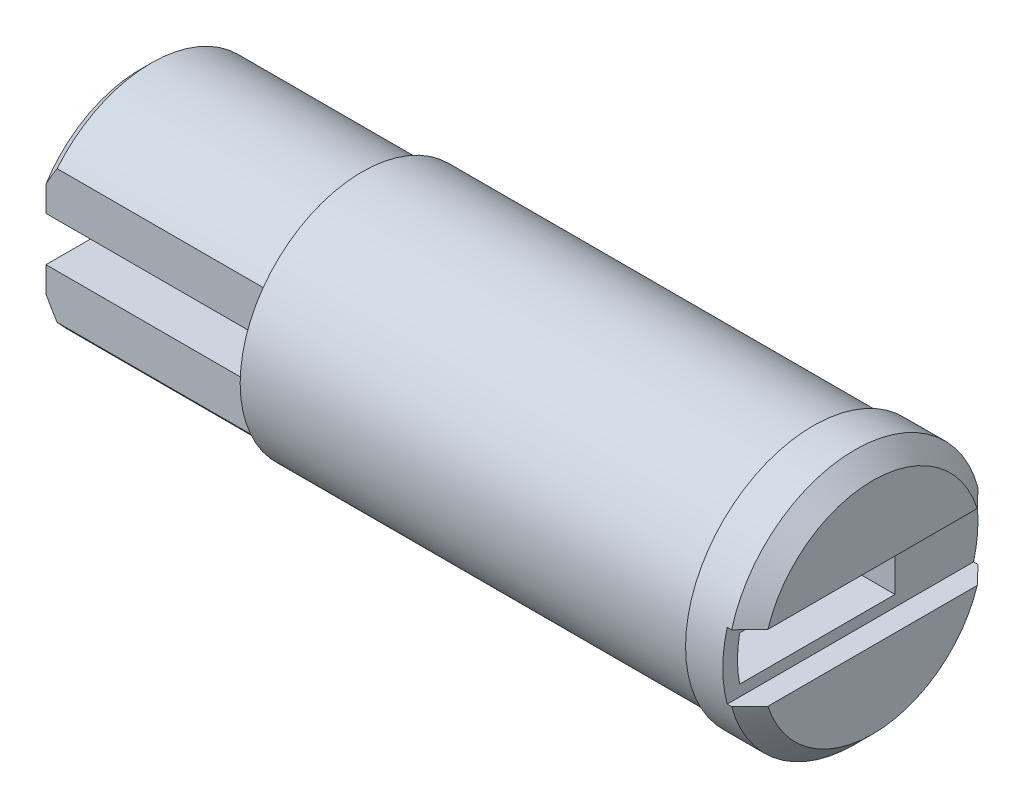
ISO-10303-21;
HEADER;
FILE_DESCRIPTION(('STEP AP214'),'2;1');
FILE_NAME('part.step','',(''),(''),'','','');
FILE_SCHEMA(('AUTOMOTIVE_DESIGN { 1 0 10303 214 1 1 1 1 }'));
ENDSEC;
DATA;
#1=APPLICATION_CONTEXT('core data for automotive mechanical design processes');
#2=APPLICATION_PROTOCOL_DEFINITION('international standard','automotive_design',2000,#1);
#3=PRODUCT_CONTEXT('',#1,'mechanical');
#4=PRODUCT('Part','Part','',(#3));
#5=PRODUCT_RELATED_PRODUCT_CATEGORY('part','',(#4));
#6=PRODUCT_DEFINITION_FORMATION('','',#4);
#7=PRODUCT_DEFINITION_CONTEXT('part definition',#1,'design');
#8=PRODUCT_DEFINITION('design','',#6,#7);
#9=PRODUCT_DEFINITION_SHAPE('','',#8);
#10=(LENGTH_UNIT() NAMED_UNIT(*) SI_UNIT(.MILLI.,.METRE.));
#11=(NAMED_UNIT(*) PLANE_ANGLE_UNIT() SI_UNIT($,.RADIAN.));
#12=(NAMED_UNIT(*) SI_UNIT($,.STERADIAN.) SOLID_ANGLE_UNIT());
#13=UNCERTAINTY_MEASURE_WITH_UNIT(LENGTH_MEASURE(1.E-05),#10,'distance_accuracy_value','');
#14=(GEOMETRIC_REPRESENTATION_CONTEXT(3) GLOBAL_UNCERTAINTY_ASSIGNED_CONTEXT((#13)) GLOBAL_UNIT_ASSIGNED_CONTEXT((#10,
#11,#12)) REPRESENTATION_CONTEXT('',''));
#15=CARTESIAN_POINT('',(0.,0.,0.));
#16=DIRECTION('',(0.,0.,1.));
#17=DIRECTION('',(1.,0.,0.));
#18=AXIS2_PLACEMENT_3D('',#15,#16,#17);
#19=CARTESIAN_POINT('',(-2.,3.,4.25));
#20=DIRECTION('',(0.,0.,-1.));
#21=DIRECTION('',(-1.,0.,0.));
#22=AXIS2_PLACEMENT_3D('',#19,#20,#21);
#23=PLANE('',#22);
#24=DIRECTION('',(0.,1.,0.));
#25=VECTOR('',#24,1.);
#26=CARTESIAN_POINT('',(8.,3.,4.25));
#27=LINE('',#26,#25);
#28=CARTESIAN_POINT('',(8.,-3.,4.25));
#29=VERTEX_POINT('',#28);
#30=CARTESIAN_POINT('',(8.,-1.,4.25));
#31=VERTEX_POINT('',#30);
#32=EDGE_CURVE('E204',#29,#31,#27,.T.);
#33=ORIENTED_EDGE('',*,*,#32,.T.);
#34=DIRECTION('',(-1.,0.,0.));
#35=VECTOR('',#34,1.);
#36=CARTESIAN_POINT('',(-2.,-1.,4.25));
#37=LINE('',#36,#35);
#38=CARTESIAN_POINT('',(-2.,-1.,4.25));
#39=VERTEX_POINT('',#38);
#40=EDGE_CURVE('E193',#31,#39,#37,.T.);
#41=ORIENTED_EDGE('',*,*,#40,.T.);
#42=DIRECTION('',(0.,1.,0.));
#43=VECTOR('',#42,1.);
#44=CARTESIAN_POINT('',(-2.,3.,4.25));
#45=LINE('',#44,#43);
#46=CARTESIAN_POINT('',(-2.,-2.14783030103756,4.25));
#47=VERTEX_POINT('',#46);
#48=EDGE_CURVE('E205',#47,#39,#45,.T.);
#49=ORIENTED_EDGE('',*,*,#48,.F.);
#50=CARTESIAN_POINT('',(-2.,-2.14783030103756,4.25));
#51=CARTESIAN_POINT('',(-1.96136096445825,-2.22058458919887,4.25));
#52=CARTESIAN_POINT('',(-1.92184405055517,-2.29286754843841,4.25));
#53=CARTESIAN_POINT('',(-1.84125213542231,-2.4365232828716,4.25));
#54=CARTESIAN_POINT('',(-1.80017774846276,-2.50789640236822,4.25));
#55=CARTESIAN_POINT('',(-1.71664051598513,-2.64981754337214,4.25));
#56=CARTESIAN_POINT('',(-1.6741777507649,-2.72036561227755,4.25));
#57=CARTESIAN_POINT('',(-1.58799284687577,-2.86072672688115,4.25));
#58=CARTESIAN_POINT('',(-1.54427022308355,-2.93053947491529,4.25));
#59=CARTESIAN_POINT('',(-1.5,-3.,4.25));
#60=B_SPLINE_CURVE_WITH_KNOTS('',3,(#50,#51,#52,#53,#54,#55,#56,#57,#58,#59),.UNSPECIFIED.,.F.,
.F.,(4,2,2,2,4),(0.,0.247121990754865,0.494147509738748,0.741158767008643,0.988266444534275),.UNSPECIFIED.);
#61=CARTESIAN_POINT('',(-1.5,-3.,4.25));
#62=VERTEX_POINT('',#61);
#63=EDGE_CURVE('E409',#47,#62,#60,.T.);
#64=ORIENTED_EDGE('',*,*,#63,.T.);
#65=DIRECTION('',(1.,0.,0.));
#66=VECTOR('',#65,1.);
#67=CARTESIAN_POINT('',(-2.,-3.,4.25));
#68=LINE('',#67,#66);
#69=EDGE_CURVE('E222',#62,#29,#68,.T.);
#70=ORIENTED_EDGE('',*,*,#69,.T.);
#71=EDGE_LOOP('',(#33,#41,#49,#64,#70));
#72=FACE_BOUND('',#71,.T.);
#73=ADVANCED_FACE('F33',(#72),#23,.F.);
#74=CARTESIAN_POINT('',(8.,0.,0.));
#75=DIRECTION('',(-1.,0.,0.));
#76=DIRECTION('',(0.,0.,1.));
#77=AXIS2_PLACEMENT_3D('',#74,#75,#76);
#78=PLANE('',#77);
#79=DIRECTION('',(0.,0.,1.));
#80=VECTOR('',#79,1.);
#81=CARTESIAN_POINT('',(8.,-1.,0.));
#82=LINE('',#81,#80);
#83=CARTESIAN_POINT('',(8.,-0.999999999999999,4.99015542280877));
#84=VERTEX_POINT('',#83);
#85=EDGE_CURVE('E196',#31,#84,#82,.T.);
#86=ORIENTED_EDGE('',*,*,#85,.F.);
#87=ORIENTED_EDGE('',*,*,#32,.F.);
#88=CARTESIAN_POINT('',(8.,0.515625000000004,0.));
#89=DIRECTION('',(-1.,0.,0.));
#90=DIRECTION('',(0.,0.,1.));
#91=AXIS2_PLACEMENT_3D('',#88,#89,#90);
#92=CIRCLE('',#91,5.515625);
#93=CARTESIAN_POINT('',(8.,-3.,-4.25));
#94=VERTEX_POINT('',#93);
#95=EDGE_CURVE('E214',#94,#29,#92,.T.);
#96=ORIENTED_EDGE('',*,*,#95,.F.);
#97=DIRECTION('',(0.,-1.,0.));
#98=VECTOR('',#97,1.);
#99=CARTESIAN_POINT('',(8.,3.,-4.25));
#100=LINE('',#99,#98);
#101=CARTESIAN_POINT('',(8.,3.,-4.25));
#102=VERTEX_POINT('',#101);
#103=EDGE_CURVE('E211',#102,#94,#100,.T.);
#104=ORIENTED_EDGE('',*,*,#103,.F.);
#105=CARTESIAN_POINT('',(8.,-0.515625000000004,0.));
#106=DIRECTION('',(-1.,0.,0.));
#107=DIRECTION('',(0.,0.,-1.));
#108=AXIS2_PLACEMENT_3D('',#105,#106,#107);
#109=CIRCLE('',#108,5.515625);
#110=CARTESIAN_POINT('',(8.,3.,4.25));
#111=VERTEX_POINT('',#110);
#112=EDGE_CURVE('E199',#111,#102,#109,.T.);
#113=ORIENTED_EDGE('',*,*,#112,.F.);
#114=CARTESIAN_POINT('',(8.,0.999999999999999,4.25));
#115=VERTEX_POINT('',#114);
#116=EDGE_CURVE('E217',#115,#111,#27,.T.);
#117=ORIENTED_EDGE('',*,*,#116,.F.);
#118=DIRECTION('',(0.,0.,-1.));
#119=VECTOR('',#118,1.);
#120=CARTESIAN_POINT('',(8.,1.,0.));
#121=LINE('',#120,#119);
#122=CARTESIAN_POINT('',(8.,0.999999999999999,4.99015542280877));
#123=VERTEX_POINT('',#122);
#124=EDGE_CURVE('E191',#123,#115,#121,.T.);
#125=ORIENTED_EDGE('',*,*,#124,.F.);
#126=CARTESIAN_POINT('',(8.,0.,0.));
#127=DIRECTION('',(-1.,0.,0.));
#128=DIRECTION('',(0.,0.,1.));
#129=AXIS2_PLACEMENT_3D('',#126,#127,#128);
#130=CIRCLE('',#129,5.08936647764609);
#131=EDGE_CURVE('E168',#84,#123,#130,.T.);
#132=ORIENTED_EDGE('',*,*,#131,.F.);
#133=EDGE_LOOP('',(#86,#87,#96,#104,#113,#117,#125,#132));
#134=FACE_BOUND('',#133,.T.);
#135=CARTESIAN_POINT('',(8.,0.,0.));
#136=DIRECTION('',(-1.,0.,0.));
#137=DIRECTION('',(0.,0.,1.));
#138=AXIS2_PLACEMENT_3D('',#135,#136,#137);
#139=CIRCLE('',#138,5.5);
#140=CARTESIAN_POINT('',(8.,0.,5.5));
#141=VERTEX_POINT('',#140);
#142=EDGE_CURVE('E228',#141,#141,#139,.T.);
#143=ORIENTED_EDGE('',*,*,#142,.T.);
#144=EDGE_LOOP('',(#143));
#145=FACE_BOUND('',#144,.T.);
#146=ADVANCED_FACE('F295',(#134,#145),#78,.T.);
#147=CARTESIAN_POINT('',(0.,0.,0.));
#148=DIRECTION('',(-1.,0.,0.));
#149=DIRECTION('',(0.,0.,1.));
#150=AXIS2_PLACEMENT_3D('',#147,#148,#149);
#151=CYLINDRICAL_SURFACE('',#150,5.5);
#152=CARTESIAN_POINT('',(28.3218681851233,0.,0.));
#153=DIRECTION('',(-1.,0.,0.));
#154=DIRECTION('',(0.,0.,1.));
#155=AXIS2_PLACEMENT_3D('',#152,#153,#154);
#156=CIRCLE('',#155,5.5);
#157=CARTESIAN_POINT('',(28.3218681851233,0.,5.5));
#158=VERTEX_POINT('',#157);
#159=EDGE_CURVE('E251',#158,#158,#156,.T.);
#160=ORIENTED_EDGE('',*,*,#159,.T.);
#161=EDGE_LOOP('',(#160));
#162=FACE_BOUND('',#161,.T.);
#163=ORIENTED_EDGE('',*,*,#142,.F.);
#164=EDGE_LOOP('',(#163));
#165=FACE_BOUND('',#164,.T.);
#166=ADVANCED_FACE('F291',(#162,#165),#151,.T.);
#167=CARTESIAN_POINT('',(31.,0.,0.));
#168=DIRECTION('',(-1.,0.,0.));
#169=DIRECTION('',(0.,0.,1.));
#170=AXIS2_PLACEMENT_3D('',#167,#168,#169);
#171=PLANE('',#170);
#172=CARTESIAN_POINT('',(31.,0.,0.));
#173=DIRECTION('',(-1.,0.,0.));
#174=DIRECTION('',(0.,0.,1.));
#175=AXIS2_PLACEMENT_3D('',#172,#173,#174);
#176=CIRCLE('',#175,4.95);
#177=CARTESIAN_POINT('',(31.,-1.5,4.71725555805492));
#178=VERTEX_POINT('',#177);
#179=CARTESIAN_POINT('',(31.,-1.5,-4.71725555805492));
#180=VERTEX_POINT('',#179);
#181=EDGE_CURVE('E262',#178,#180,#176,.F.);
#182=ORIENTED_EDGE('',*,*,#181,.T.);
#183=DIRECTION('',(0.,0.,-1.));
#184=VECTOR('',#183,1.);
#185=CARTESIAN_POINT('',(31.,-1.5,-6.47568722775106));
#186=LINE('',#185,#184);
#187=EDGE_CURVE('E233',#178,#180,#186,.T.);
#188=ORIENTED_EDGE('',*,*,#187,.F.);
#189=EDGE_LOOP('',(#182,#188));
#190=FACE_BOUND('',#189,.T.);
#191=ADVANCED_FACE('F294',(#190),#171,.F.);
#192=CARTESIAN_POINT('',(30.2,0.,0.));
#193=DIRECTION('',(-1.,0.,0.));
#194=DIRECTION('',(0.,0.,1.));
#195=AXIS2_PLACEMENT_3D('',#192,#193,#194);
#196=CONICAL_SURFACE('',#195,5.75,0.785398163397447);
#197=CARTESIAN_POINT('',(23.2831244979976,-1.5,12.5777476116842));
#198=CARTESIAN_POINT('',(23.6106125192825,-1.5,12.2479317848869));
#199=CARTESIAN_POINT('',(23.938016440083,-1.5,11.9180323555354));
#200=CARTESIAN_POINT('',(24.5926599526162,-1.5,11.2579311822591));
#201=CARTESIAN_POINT('',(24.919899494525,-1.5,10.9277293889257));
#202=CARTESIAN_POINT('',(25.575474802564,-1.5,10.2656186582));
#203=CARTESIAN_POINT('',(25.9038092856133,-1.5,9.93370845015689));
#204=CARTESIAN_POINT('',(26.5600030119619,-1.5,9.26955670004262));
#205=CARTESIAN_POINT('',(26.8878623408399,-1.5,8.93731524254916));
#206=CARTESIAN_POINT('',(27.4866309286773,-1.5,8.32951666405265));
#207=CARTESIAN_POINT('',(27.7576286275234,-1.5,8.05404669087916));
#208=CARTESIAN_POINT('',(28.2991106065372,-1.5,7.50258892540886));
#209=CARTESIAN_POINT('',(28.5695948737149,-1.5,7.22660112035295));
#210=CARTESIAN_POINT('',(29.1100553942131,-1.5,6.6736991111905));
#211=CARTESIAN_POINT('',(29.3800310733099,-1.5,6.39678434534002));
#212=CARTESIAN_POINT('',(29.9189042539413,-1.5,5.84195868206374));
#213=CARTESIAN_POINT('',(30.187801856092,-1.5,5.56404788240879));
#214=CARTESIAN_POINT('',(30.7228839913038,-1.5,5.00785000532498));
#215=CARTESIAN_POINT('',(30.9890751624553,-1.5,4.72956933197649));
#216=CARTESIAN_POINT('',(31.3864395323754,-1.5,4.31022532675707));
#217=CARTESIAN_POINT('',(31.5185986617121,-1.5,4.17009688991528));
#218=CARTESIAN_POINT('',(31.7820272926027,-1.5,3.88901186832305));
#219=CARTESIAN_POINT('',(31.913296816015,-1.5,3.7480553040804));
#220=CARTESIAN_POINT('',(32.1744286099579,-1.5,3.46524033695717));
#221=CARTESIAN_POINT('',(32.304292722371,-1.5,3.32338363865537));
#222=CARTESIAN_POINT('',(32.5623041698702,-1.5,3.03812241561348));
#223=CARTESIAN_POINT('',(32.6904515534735,-1.5,2.89471793482372));
#224=CARTESIAN_POINT('',(32.9441476184633,-1.5,2.60575908799829));
#225=CARTESIAN_POINT('',(33.0696977729846,-1.5,2.46020602564568));
#226=CARTESIAN_POINT('',(33.254985928031,-1.5,2.2393481135037));
#227=CARTESIAN_POINT('',(33.3162372381257,-1.5,2.16531401426996));
#228=CARTESIAN_POINT('',(33.4374196033146,-1.5,2.01617470445725));
#229=CARTESIAN_POINT('',(33.4973507348241,-1.5,1.94106955629006));
#230=CARTESIAN_POINT('',(33.5782698436103,-1.5,1.83722903202372));
#231=CARTESIAN_POINT('',(33.600012247261,-1.5,1.80908081953309));
#232=CARTESIAN_POINT('',(33.6432281273821,-1.5,1.75257753142135));
#233=CARTESIAN_POINT('',(33.6647015966592,-1.5,1.72422245029902));
#234=CARTESIAN_POINT('',(33.7286739687197,-1.5,1.6388152497477));
#235=CARTESIAN_POINT('',(33.7707225538424,-1.5,1.58142408913306));
#236=CARTESIAN_POINT('',(33.8534038385082,-1.5,1.46539312270642));
#237=CARTESIAN_POINT('',(33.8940324357551,-1.5,1.40675037945692));
#238=CARTESIAN_POINT('',(33.9732995803079,-1.5,1.288135716928));
#239=CARTESIAN_POINT('',(34.0119382273678,-1.5,1.22816386449122));
#240=CARTESIAN_POINT('',(34.0852433937047,-1.5,1.10880657043406));
#241=CARTESIAN_POINT('',(34.1200034130085,-1.5,1.04947960158135));
#242=CARTESIAN_POINT('',(34.1863019805062,-1.5,0.929065553211411));
#243=CARTESIAN_POINT('',(34.2178394013315,-1.5,0.867977867255189));
#244=CARTESIAN_POINT('',(34.3057927505497,-1.5,0.682114449087072));
#245=CARTESIAN_POINT('',(34.3560086218704,-1.5,0.554037627098471));
#246=CARTESIAN_POINT('',(34.4034701847537,-1.5,0.378795610938711));
#247=CARTESIAN_POINT('',(34.4136358828838,-1.5,0.335090660882677));
#248=CARTESIAN_POINT('',(34.4304174031391,-1.5,0.246983491824971));
#249=CARTESIAN_POINT('',(34.4370327403313,-1.5,0.202581178424623));
#250=CARTESIAN_POINT('',(34.4463609186601,-1.5,0.113510335232054));
#251=CARTESIAN_POINT('',(34.4490864380443,-1.5,0.0688431490010885));
#252=CARTESIAN_POINT('',(34.4505252212899,-1.5,-0.020571057366597));
#253=CARTESIAN_POINT('',(34.4492372483295,-1.5,-0.0653180978651294));
#254=CARTESIAN_POINT('',(34.4427271558943,-1.5,-0.154404803754268));
#255=CARTESIAN_POINT('',(34.437515142812,-1.5,-0.198745219969365));
#256=CARTESIAN_POINT('',(34.4234393611576,-1.5,-0.286844656095083));
#257=CARTESIAN_POINT('',(34.414574723681,-1.5,-0.330603535108224));
#258=CARTESIAN_POINT('',(34.3935540216483,-1.5,-0.417506018885773));
#259=CARTESIAN_POINT('',(34.381384465674,-1.5,-0.460646321286136));
#260=CARTESIAN_POINT('',(34.3542244948807,-1.5,-0.546016805708314));
#261=CARTESIAN_POINT('',(34.3392341358132,-1.5,-0.588247005699423));
#262=CARTESIAN_POINT('',(34.2797611208826,-1.5,-0.741873156115527));
#263=CARTESIAN_POINT('',(34.2279922142325,-1.5,-0.850444267426383));
#264=CARTESIAN_POINT('',(34.1142149851413,-1.5,-1.06211675493479));
#265=CARTESIAN_POINT('',(34.052181438521,-1.5,-1.16520380882772));
#266=CARTESIAN_POINT('',(33.9213351830724,-1.5,-1.36802963557161));
#267=CARTESIAN_POINT('',(33.8524754570487,-1.5,-1.46773777929211));
#268=CARTESIAN_POINT('',(33.7461410999326,-1.5,-1.61497008208429));
#269=CARTESIAN_POINT('',(33.7102104859219,-1.5,-1.66363175908382));
#270=CARTESIAN_POINT('',(33.637494720863,-1.5,-1.76031156483775));
#271=CARTESIAN_POINT('',(33.600709599108,-1.5,-1.80832971556395));
#272=CARTESIAN_POINT('',(33.4796280208949,-1.5,-1.96401731251528));
#273=CARTESIAN_POINT('',(33.3938988034742,-1.5,-2.07057105801895));
#274=CARTESIAN_POINT('',(33.2200465185019,-1.5,-2.28171271706748));
#275=CARTESIAN_POINT('',(33.1319231607852,-1.5,-2.3863003897058));
#276=CARTESIAN_POINT('',(32.9539550515347,-1.5,-2.59406226396158));
#277=CARTESIAN_POINT('',(32.8641096961761,-1.5,-2.69723594717521));
#278=CARTESIAN_POINT('',(32.683178565385,-1.5,-2.90249140614543));
#279=CARTESIAN_POINT('',(32.5920927586895,-1.5,-3.00457315426586));
#280=CARTESIAN_POINT('',(32.3171929099314,-1.5,-3.30986483996333));
#281=CARTESIAN_POINT('',(32.1319930942354,-1.5,-3.51182558550891));
#282=CARTESIAN_POINT('',(31.7594175960904,-1.5,-3.91363754986367));
#283=CARTESIAN_POINT('',(31.5720423918757,-1.5,-4.11348921455511));
#284=CARTESIAN_POINT('',(31.1967466463848,-1.5,-4.51083764212696));
#285=CARTESIAN_POINT('',(31.0088332265588,-1.5,-4.70834113723603));
#286=CARTESIAN_POINT('',(30.6319939307126,-1.5,-5.10239927391052));
#287=CARTESIAN_POINT('',(30.4430679993581,-1.5,-5.29895386247848));
#288=CARTESIAN_POINT('',(29.8755083067196,-1.5,-5.88729473304938));
#289=CARTESIAN_POINT('',(29.4958109749607,-1.5,-6.27805436866732));
#290=CARTESIAN_POINT('',(28.6329776607364,-1.5,-7.16243442168079));
#291=CARTESIAN_POINT('',(28.149362603451,-1.5,-7.65558638620526));
#292=CARTESIAN_POINT('',(27.1805869842656,-1.5,-8.640626996177));
#293=CARTESIAN_POINT('',(26.6954260452392,-1.5,-9.13251527040277));
#294=CARTESIAN_POINT('',(25.7226688780455,-1.5,-10.1170204563805));
#295=CARTESIAN_POINT('',(25.2350698442585,-1.5,-10.6096345942695));
#296=CARTESIAN_POINT('',(24.2594088653942,-1.5,-11.5941350078477));
#297=CARTESIAN_POINT('',(23.7713470851387,-1.5,-12.0860214468485));
#298=CARTESIAN_POINT('',(23.2831244979976,-1.5,-12.5777476116842));
#299=B_SPLINE_CURVE_WITH_KNOTS('',3,(#197,#198,#199,#200,#201,#202,#203,#204,#205,#206,#207,
#208,#209,#210,#211,#212,#213,#214,#215,#216,#217,#218,#219,#220,#221,#222,#223,#224,#225,#226,
#227,#228,#229,#230,#231,#232,#233,#234,#235,#236,#237,#238,#239,#240,#241,#242,#243,#244,#245,
#246,#247,#248,#249,#250,#251,#252,#253,#254,#255,#256,#257,#258,#259,#260,#261,#262,#263,#264,
#265,#266,#267,#268,#269,#270,#271,#272,#273,#274,#275,#276,#277,#278,#279,#280,#281,#282,#283,
#284,#285,#286,#287,#288,#289,#290,#291,#292,#293,#294,#295,#296,#297,#298),.UNSPECIFIED.,.F.,
.F.,(4,2,2,2,2,2,2,2,2,2,2,2,2,2,2,2,2,2,2,2,2,2,2,2,2,2,2,2,2,2,2,2,2,2,2,2,2,2,2,2,2,2,2,2,2,
2,2,2,2,2,4),(0.,1.39436085642939,2.78901856368167,4.18962935028232,5.58994493713984,
6.74921624263865,7.908516497228,9.06873765369732,10.2288478821171,11.3841194007283,
11.96197310918,12.5398125674609,13.1167701859679,13.6937114642507,14.27031599776,
14.5585678042671,14.8468028819533,14.9535043032202,15.0602085724006,15.2736282168673,
15.4876205688081,15.7016021831027,15.9077746389568,16.1140189753981,16.5240049403917,
16.6585009472847,16.793015319906,16.9270902549673,17.06120651145,17.1949785271947,
17.3287823836857,17.4631408886124,17.5974967382958,17.9572610890428,18.3179230193865,
18.6812691372777,18.8627326688357,19.0441899888488,19.4544097997938,19.8646795523303,
20.2750958993874,20.6855226093559,21.5075503147036,22.3294006054856,23.1472409671418,
23.9651264895591,25.5996712252683,27.6718014614,29.744483271455,31.8238560684431,
33.9026551998655),.UNSPECIFIED.);
#300=CARTESIAN_POINT('',(30.2,-1.5,5.55090082779363));
#301=VERTEX_POINT('',#300);
#302=EDGE_CURVE('E399',#301,#178,#299,.T.);
#303=ORIENTED_EDGE('',*,*,#302,.F.);
#304=CARTESIAN_POINT('',(30.2,0.,0.));
#305=DIRECTION('',(-1.,0.,0.));
#306=DIRECTION('',(0.,0.,1.));
#307=AXIS2_PLACEMENT_3D('',#304,#305,#306);
#308=CIRCLE('',#307,5.75);
#309=CARTESIAN_POINT('',(30.2,-1.5,-5.55090082779363));
#310=VERTEX_POINT('',#309);
#311=EDGE_CURVE('E257',#310,#301,#308,.T.);
#312=ORIENTED_EDGE('',*,*,#311,.F.);
#313=EDGE_CURVE('E273',#180,#310,#299,.T.);
#314=ORIENTED_EDGE('',*,*,#313,.F.);
#315=ORIENTED_EDGE('',*,*,#181,.F.);
#316=EDGE_LOOP('',(#303,#312,#314,#315));
#317=FACE_BOUND('',#316,.T.);
#318=ADVANCED_FACE('F306',(#317),#196,.T.);
#319=CARTESIAN_POINT('',(31.,1.5,-4.71725555805492));
#320=VERTEX_POINT('',#319);
#321=CARTESIAN_POINT('',(31.,1.5,4.71725555805492));
#322=VERTEX_POINT('',#321);
#323=EDGE_CURVE('E261',#320,#322,#176,.F.);
#324=ORIENTED_EDGE('',*,*,#323,.T.);
#325=DIRECTION('',(0.,0.,1.));
#326=VECTOR('',#325,1.);
#327=CARTESIAN_POINT('',(31.,1.5,-6.47568722775106));
#328=LINE('',#327,#326);
#329=EDGE_CURVE('E237',#320,#322,#328,.T.);
#330=ORIENTED_EDGE('',*,*,#329,.F.);
#331=EDGE_LOOP('',(#324,#330));
#332=FACE_BOUND('',#331,.T.);
#333=ADVANCED_FACE('F303',(#332),#171,.F.);
#334=CARTESIAN_POINT('',(0.,0.,0.));
#335=DIRECTION('',(-1.,0.,0.));
#336=DIRECTION('',(0.,0.,1.));
#337=AXIS2_PLACEMENT_3D('',#334,#335,#336);
#338=CYLINDRICAL_SURFACE('',#337,5.75);
#339=CARTESIAN_POINT('',(30.,0.,0.));
#340=DIRECTION('',(-1.,0.,0.));
#341=DIRECTION('',(0.,0.,1.));
#342=AXIS2_PLACEMENT_3D('',#339,#340,#341);
#343=CIRCLE('',#342,5.75);
#344=CARTESIAN_POINT('',(30.,1.5,-5.55090082779363));
#345=VERTEX_POINT('',#344);
#346=CARTESIAN_POINT('',(30.,-1.5,-5.55090082779363));
#347=VERTEX_POINT('',#346);
#348=EDGE_CURVE('E396',#345,#347,#343,.T.);
#349=ORIENTED_EDGE('',*,*,#348,.T.);
#350=DIRECTION('',(-1.,0.,0.));
#351=VECTOR('',#350,1.);
#352=CARTESIAN_POINT('',(0.,-1.5,-5.55090082779363));
#353=LINE('',#352,#351);
#354=EDGE_CURVE('E245',#347,#310,#353,.F.);
#355=ORIENTED_EDGE('',*,*,#354,.T.);
#356=ORIENTED_EDGE('',*,*,#311,.T.);
#357=DIRECTION('',(-1.,0.,0.));
#358=VECTOR('',#357,1.);
#359=CARTESIAN_POINT('',(0.,-1.5,5.55090082779363));
#360=LINE('',#359,#358);
#361=CARTESIAN_POINT('',(30.,-1.5,5.55090082779363));
#362=VERTEX_POINT('',#361);
#363=EDGE_CURVE('E248',#301,#362,#360,.T.);
#364=ORIENTED_EDGE('',*,*,#363,.T.);
#365=CARTESIAN_POINT('',(30.,1.5,5.55090082779363));
#366=VERTEX_POINT('',#365);
#367=EDGE_CURVE('E393',#362,#366,#343,.T.);
#368=ORIENTED_EDGE('',*,*,#367,.T.);
#369=DIRECTION('',(-1.,0.,0.));
#370=VECTOR('',#369,1.);
#371=CARTESIAN_POINT('',(0.,1.5,5.55090082779363));
#372=LINE('',#371,#370);
#373=CARTESIAN_POINT('',(30.2,1.5,5.55090082779363));
#374=VERTEX_POINT('',#373);
#375=EDGE_CURVE('E236',#366,#374,#372,.F.);
#376=ORIENTED_EDGE('',*,*,#375,.T.);
#377=CARTESIAN_POINT('',(30.2,1.5,-5.55090082779363));
#378=VERTEX_POINT('',#377);
#379=EDGE_CURVE('E258',#374,#378,#308,.T.);
#380=ORIENTED_EDGE('',*,*,#379,.T.);
#381=DIRECTION('',(-1.,0.,0.));
#382=VECTOR('',#381,1.);
#383=CARTESIAN_POINT('',(0.,1.5,-5.55090082779363));
#384=LINE('',#383,#382);
#385=EDGE_CURVE('E242',#378,#345,#384,.T.);
#386=ORIENTED_EDGE('',*,*,#385,.T.);
#387=EDGE_LOOP('',(#349,#355,#356,#364,#368,#376,#380,#386));
#388=FACE_BOUND('',#387,.T.);
#389=CARTESIAN_POINT('',(28.3218681851233,0.,0.));
#390=DIRECTION('',(-1.,0.,0.));
#391=DIRECTION('',(0.,0.,1.));
#392=AXIS2_PLACEMENT_3D('',#389,#390,#391);
#393=CIRCLE('',#392,5.75);
#394=CARTESIAN_POINT('',(28.3218681851233,0.,5.75));
#395=VERTEX_POINT('',#394);
#396=EDGE_CURVE('E254',#395,#395,#393,.T.);
#397=ORIENTED_EDGE('',*,*,#396,.F.);
#398=EDGE_LOOP('',(#397));
#399=FACE_BOUND('',#398,.T.);
#400=ADVANCED_FACE('F300',(#388,#399),#338,.T.);
#401=CARTESIAN_POINT('',(28.3218681851233,5.75,0.));
#402=DIRECTION('',(1.,0.,0.));
#403=DIRECTION('',(0.,0.,-1.));
#404=AXIS2_PLACEMENT_3D('',#401,#402,#403);
#405=PLANE('',#404);
#406=ORIENTED_EDGE('',*,*,#159,.F.);
#407=EDGE_LOOP('',(#406));
#408=FACE_BOUND('',#407,.T.);
#409=ORIENTED_EDGE('',*,*,#396,.T.);
#410=EDGE_LOOP('',(#409));
#411=FACE_BOUND('',#410,.T.);
#412=ADVANCED_FACE('F297',(#408,#411),#405,.F.);
#413=CARTESIAN_POINT('',(23.2831244979976,1.5,-12.5777476116842));
#414=CARTESIAN_POINT('',(23.6106125192825,1.5,-12.2479317848869));
#415=CARTESIAN_POINT('',(23.938016440083,1.5,-11.9180323555354));
#416=CARTESIAN_POINT('',(24.5926599526162,1.5,-11.2579311822591));
#417=CARTESIAN_POINT('',(24.919899494525,1.5,-10.9277293889257));
#418=CARTESIAN_POINT('',(25.575474802564,1.5,-10.2656186582));
#419=CARTESIAN_POINT('',(25.9038092856133,1.5,-9.9337084501569));
#420=CARTESIAN_POINT('',(26.5600030119619,1.5,-9.26955670004262));
#421=CARTESIAN_POINT('',(26.8878623408399,1.5,-8.93731524254916));
#422=CARTESIAN_POINT('',(27.4866309286773,1.5,-8.32951666405264));
#423=CARTESIAN_POINT('',(27.7576286275234,1.5,-8.05404669087916));
#424=CARTESIAN_POINT('',(28.2991106065372,1.5,-7.50258892540886));
#425=CARTESIAN_POINT('',(28.569594873715,1.5,-7.22660112035294));
#426=CARTESIAN_POINT('',(29.1100553942131,1.5,-6.6736991111905));
#427=CARTESIAN_POINT('',(29.3800310733099,1.5,-6.39678434534002));
#428=CARTESIAN_POINT('',(29.9189042539413,1.5,-5.84195868206374));
#429=CARTESIAN_POINT('',(30.187801856092,1.5,-5.56404788240879));
#430=CARTESIAN_POINT('',(30.7228839913038,1.5,-5.00785000532498));
#431=CARTESIAN_POINT('',(30.9890751624553,1.5,-4.72956933197649));
#432=CARTESIAN_POINT('',(31.3864395323754,1.5,-4.31022532675707));
#433=CARTESIAN_POINT('',(31.5185986617121,1.5,-4.17009688991528));
#434=CARTESIAN_POINT('',(31.7820272926027,1.5,-3.88901186832305));
#435=CARTESIAN_POINT('',(31.913296816015,1.5,-3.7480553040804));
#436=CARTESIAN_POINT('',(32.1744286099579,1.5,-3.46524033695717));
#437=CARTESIAN_POINT('',(32.304292722371,1.5,-3.32338363865537));
#438=CARTESIAN_POINT('',(32.5623041698702,1.5,-3.03812241561348));
#439=CARTESIAN_POINT('',(32.6904515534735,1.5,-2.89471793482373));
#440=CARTESIAN_POINT('',(32.9441476184633,1.5,-2.60575908799828));
#441=CARTESIAN_POINT('',(33.0696977729846,1.5,-2.46020602564568));
#442=CARTESIAN_POINT('',(33.254985928031,1.5,-2.23934811350369));
#443=CARTESIAN_POINT('',(33.3162372381257,1.5,-2.16531401426995));
#444=CARTESIAN_POINT('',(33.4374196033146,1.5,-2.01617470445725));
#445=CARTESIAN_POINT('',(33.4973507348241,1.5,-1.94106955629006));
#446=CARTESIAN_POINT('',(33.5782698436103,1.5,-1.83722903202372));
#447=CARTESIAN_POINT('',(33.600012247261,1.5,-1.80908081953309));
#448=CARTESIAN_POINT('',(33.6432281273821,1.5,-1.75257753142136));
#449=CARTESIAN_POINT('',(33.6647015966592,1.5,-1.72422245029902));
#450=CARTESIAN_POINT('',(33.7286739687196,1.5,-1.63881524974771));
#451=CARTESIAN_POINT('',(33.7707225538424,1.5,-1.58142408913306));
#452=CARTESIAN_POINT('',(33.8534038385082,1.5,-1.46539312270642));
#453=CARTESIAN_POINT('',(33.8940324357551,1.5,-1.40675037945692));
#454=CARTESIAN_POINT('',(33.9732995803079,1.5,-1.288135716928));
#455=CARTESIAN_POINT('',(34.0119382273678,1.5,-1.22816386449122));
#456=CARTESIAN_POINT('',(34.0852433937047,1.5,-1.10880657043406));
#457=CARTESIAN_POINT('',(34.1200034130085,1.5,-1.04947960158135));
#458=CARTESIAN_POINT('',(34.1863019805062,1.5,-0.929065553211411));
#459=CARTESIAN_POINT('',(34.2178394013315,1.5,-0.867977867255189));
#460=CARTESIAN_POINT('',(34.3057927505497,1.5,-0.68211444908707));
#461=CARTESIAN_POINT('',(34.3560086218704,1.5,-0.554037627098469));
#462=CARTESIAN_POINT('',(34.4034701847537,1.5,-0.378795610938709));
#463=CARTESIAN_POINT('',(34.4136358828838,1.5,-0.335090660882674));
#464=CARTESIAN_POINT('',(34.4304174031391,1.5,-0.246983491824969));
#465=CARTESIAN_POINT('',(34.4370327403313,1.5,-0.20258117842462));
#466=CARTESIAN_POINT('',(34.4463609186601,1.5,-0.113510335232052));
#467=CARTESIAN_POINT('',(34.4490864380443,1.5,-0.0688431490010862));
#468=CARTESIAN_POINT('',(34.4505252212899,1.5,0.0205710573665991));
#469=CARTESIAN_POINT('',(34.4492372483295,1.5,0.0653180978651312));
#470=CARTESIAN_POINT('',(34.4427271558943,1.5,0.15440480375427));
#471=CARTESIAN_POINT('',(34.437515142812,1.5,0.198745219969369));
#472=CARTESIAN_POINT('',(34.4234393611576,1.5,0.286844656095087));
#473=CARTESIAN_POINT('',(34.414574723681,1.5,0.330603535108226));
#474=CARTESIAN_POINT('',(34.3935540216482,1.5,0.417506018885776));
#475=CARTESIAN_POINT('',(34.381384465674,1.5,0.46064632128614));
#476=CARTESIAN_POINT('',(34.3542244948807,1.5,0.546016805708319));
#477=CARTESIAN_POINT('',(34.3392341358132,1.5,0.588247005699427));
#478=CARTESIAN_POINT('',(34.2797611208826,1.5,0.741873156115528));
#479=CARTESIAN_POINT('',(34.2279922142325,1.5,0.850444267426383));
#480=CARTESIAN_POINT('',(34.1142149851413,1.5,1.06211675493479));
#481=CARTESIAN_POINT('',(34.052181438521,1.5,1.16520380882772));
#482=CARTESIAN_POINT('',(33.9213351830724,1.5,1.36802963557162));
#483=CARTESIAN_POINT('',(33.8524754570487,1.5,1.46773777929212));
#484=CARTESIAN_POINT('',(33.7461410999326,1.5,1.6149700820843));
#485=CARTESIAN_POINT('',(33.7102104859219,1.5,1.66363175908383));
#486=CARTESIAN_POINT('',(33.637494720863,1.5,1.76031156483775));
#487=CARTESIAN_POINT('',(33.600709599108,1.5,1.80832971556395));
#488=CARTESIAN_POINT('',(33.4796280208949,1.5,1.96401731251529));
#489=CARTESIAN_POINT('',(33.3938988034742,1.5,2.07057105801896));
#490=CARTESIAN_POINT('',(33.2200465185018,1.5,2.28171271706748));
#491=CARTESIAN_POINT('',(33.1319231607852,1.5,2.38630038970581));
#492=CARTESIAN_POINT('',(32.9539550515347,1.5,2.59406226396159));
#493=CARTESIAN_POINT('',(32.8641096961761,1.5,2.69723594717522));
#494=CARTESIAN_POINT('',(32.683178565385,1.5,2.90249140614545));
#495=CARTESIAN_POINT('',(32.5920927586894,1.5,3.00457315426587));
#496=CARTESIAN_POINT('',(32.3171929099314,1.5,3.30986483996334));
#497=CARTESIAN_POINT('',(32.1319930942354,1.5,3.51182558550892));
#498=CARTESIAN_POINT('',(31.7594175960904,1.5,3.91363754986369));
#499=CARTESIAN_POINT('',(31.5720423918757,1.5,4.11348921455513));
#500=CARTESIAN_POINT('',(31.1967466463848,1.5,4.51083764212698));
#501=CARTESIAN_POINT('',(31.0088332265588,1.5,4.70834113723605));
#502=CARTESIAN_POINT('',(30.6319939307126,1.5,5.10239927391055));
#503=CARTESIAN_POINT('',(30.4430679993581,1.5,5.29895386247851));
#504=CARTESIAN_POINT('',(29.8755083067196,1.5,5.88729473304941));
#505=CARTESIAN_POINT('',(29.4958109749607,1.5,6.27805436866735));
#506=CARTESIAN_POINT('',(28.6329776607364,1.5,7.16243442168082));
#507=CARTESIAN_POINT('',(28.149362603451,1.5,7.65558638620528));
#508=CARTESIAN_POINT('',(27.1805869842655,1.5,8.64062699617702));
#509=CARTESIAN_POINT('',(26.6954260452392,1.5,9.13251527040278));
#510=CARTESIAN_POINT('',(25.7226688780455,1.5,10.1170204563805));
#511=CARTESIAN_POINT('',(25.2350698442585,1.5,10.6096345942695));
#512=CARTESIAN_POINT('',(24.2594088653942,1.5,11.5941350078477));
#513=CARTESIAN_POINT('',(23.7713470851387,1.5,12.0860214468485));
#514=CARTESIAN_POINT('',(23.2831244979976,1.5,12.5777476116842));
#515=B_SPLINE_CURVE_WITH_KNOTS('',3,(#413,#414,#415,#416,#417,#418,#419,#420,#421,#422,#423,
#424,#425,#426,#427,#428,#429,#430,#431,#432,#433,#434,#435,#436,#437,#438,#439,#440,#441,#442,
#443,#444,#445,#446,#447,#448,#449,#450,#451,#452,#453,#454,#455,#456,#457,#458,#459,#460,#461,
#462,#463,#464,#465,#466,#467,#468,#469,#470,#471,#472,#473,#474,#475,#476,#477,#478,#479,#480,
#481,#482,#483,#484,#485,#486,#487,#488,#489,#490,#491,#492,#493,#494,#495,#496,#497,#498,#499,
#500,#501,#502,#503,#504,#505,#506,#507,#508,#509,#510,#511,#512,#513,#514),.UNSPECIFIED.,.F.,
.F.,(4,2,2,2,2,2,2,2,2,2,2,2,2,2,2,2,2,2,2,2,2,2,2,2,2,2,2,2,2,2,2,2,2,2,2,2,2,2,2,2,2,2,2,2,2,
2,2,2,2,2,4),(0.,1.39436085642939,2.78901856368167,4.18962935028232,5.58994493713984,
6.74921624263865,7.908516497228,9.06873765369732,10.2288478821171,11.3841194007282,
11.96197310918,12.5398125674609,13.1167701859679,13.6937114642507,14.27031599776,
14.5585678042671,14.8468028819533,14.9535043032202,15.0602085724006,15.2736282168673,
15.4876205688081,15.7016021831027,15.9077746389568,16.1140189753981,16.5240049403917,
16.6585009472847,16.793015319906,16.9270902549673,17.06120651145,17.1949785271947,
17.3287823836857,17.4631408886124,17.5974967382958,17.9572610890428,18.3179230193865,
18.6812691372778,18.8627326688357,19.0441899888488,19.4544097997938,19.8646795523303,
20.2750958993874,20.685522609356,21.5075503147036,22.3294006054857,23.1472409671418,
23.9651264895592,25.5996712252683,27.6718014614,29.744483271455,31.8238560684431,
33.9026551998655),.UNSPECIFIED.);
#516=EDGE_CURVE('E272',#378,#320,#515,.T.);
#517=ORIENTED_EDGE('',*,*,#516,.F.);
#518=ORIENTED_EDGE('',*,*,#379,.F.);
#519=EDGE_CURVE('E265',#322,#374,#515,.T.);
#520=ORIENTED_EDGE('',*,*,#519,.F.);
#521=ORIENTED_EDGE('',*,*,#323,.F.);
#522=EDGE_LOOP('',(#517,#518,#520,#521));
#523=FACE_BOUND('',#522,.T.);
#524=ADVANCED_FACE('F279',(#523),#196,.T.);
#525=CARTESIAN_POINT('',(30.,-1.5,-6.47568722775106));
#526=DIRECTION('',(-1.,0.,0.));
#527=DIRECTION('',(0.,0.,1.));
#528=AXIS2_PLACEMENT_3D('',#525,#526,#527);
#529=PLANE('',#528);
#530=DIRECTION('',(0.,0.,1.));
#531=VECTOR('',#530,1.);
#532=CARTESIAN_POINT('',(30.,1.,-2.00984457719123));
#533=LINE('',#532,#531);
#534=CARTESIAN_POINT('',(30.,1.,-2.00984457719123));
#535=VERTEX_POINT('',#534);
#536=CARTESIAN_POINT('',(30.,0.999999999999999,4.99015542280877));
#537=VERTEX_POINT('',#536);
#538=EDGE_CURVE('E174',#535,#537,#533,.T.);
#539=ORIENTED_EDGE('',*,*,#538,.F.);
#540=DIRECTION('',(0.,1.,0.));
#541=VECTOR('',#540,1.);
#542=CARTESIAN_POINT('',(30.,1.,-2.00984457719123));
#543=LINE('',#542,#541);
#544=CARTESIAN_POINT('',(30.,-1.,-2.00984457719123));
#545=VERTEX_POINT('',#544);
#546=EDGE_CURVE('E49',#545,#535,#543,.T.);
#547=ORIENTED_EDGE('',*,*,#546,.F.);
#548=DIRECTION('',(0.,0.,-1.));
#549=VECTOR('',#548,1.);
#550=CARTESIAN_POINT('',(30.,-1.,-2.00984457719123));
#551=LINE('',#550,#549);
#552=CARTESIAN_POINT('',(30.,-0.999999999999999,4.99015542280877));
#553=VERTEX_POINT('',#552);
#554=EDGE_CURVE('E181',#553,#545,#551,.T.);
#555=ORIENTED_EDGE('',*,*,#554,.F.);
#556=CARTESIAN_POINT('',(30.,0.,0.));
#557=DIRECTION('',(1.,0.,0.));
#558=DIRECTION('',(0.,0.,-1.));
#559=AXIS2_PLACEMENT_3D('',#556,#557,#558);
#560=CIRCLE('',#559,5.08936647764609);
#561=EDGE_CURVE('E165',#537,#553,#560,.T.);
#562=ORIENTED_EDGE('',*,*,#561,.F.);
#563=EDGE_LOOP('',(#539,#547,#555,#562));
#564=FACE_BOUND('',#563,.T.);
#565=DIRECTION('',(0.,0.,1.));
#566=VECTOR('',#565,1.);
#567=CARTESIAN_POINT('',(30.,1.5,-6.47568722775106));
#568=LINE('',#567,#566);
#569=EDGE_CURVE('E229',#345,#366,#568,.T.);
#570=ORIENTED_EDGE('',*,*,#569,.T.);
#571=ORIENTED_EDGE('',*,*,#367,.F.);
#572=DIRECTION('',(0.,0.,-1.));
#573=VECTOR('',#572,1.);
#574=CARTESIAN_POINT('',(30.,-1.5,-6.47568722775106));
#575=LINE('',#574,#573);
#576=EDGE_CURVE('E232',#362,#347,#575,.T.);
#577=ORIENTED_EDGE('',*,*,#576,.T.);
#578=ORIENTED_EDGE('',*,*,#348,.F.);
#579=EDGE_LOOP('',(#570,#571,#577,#578));
#580=FACE_BOUND('',#579,.T.);
#581=ADVANCED_FACE('F178',(#564,#580),#529,.F.);
#582=CARTESIAN_POINT('',(30.,-1.5,-6.47568722775106));
#583=DIRECTION('',(0.,-1.,0.));
#584=DIRECTION('',(0.,0.,-1.));
#585=AXIS2_PLACEMENT_3D('',#582,#583,#584);
#586=PLANE('',#585);
#587=ORIENTED_EDGE('',*,*,#302,.T.);
#588=ORIENTED_EDGE('',*,*,#187,.T.);
#589=ORIENTED_EDGE('',*,*,#313,.T.);
#590=ORIENTED_EDGE('',*,*,#354,.F.);
#591=ORIENTED_EDGE('',*,*,#576,.F.);
#592=ORIENTED_EDGE('',*,*,#363,.F.);
#593=EDGE_LOOP('',(#587,#588,#589,#590,#591,#592));
#594=FACE_BOUND('',#593,.T.);
#595=ADVANCED_FACE('F287',(#594),#586,.F.);
#596=CARTESIAN_POINT('',(30.,1.5,-6.47568722775106));
#597=DIRECTION('',(0.,1.,0.));
#598=DIRECTION('',(0.,0.,1.));
#599=AXIS2_PLACEMENT_3D('',#596,#597,#598);
#600=PLANE('',#599);
#601=ORIENTED_EDGE('',*,*,#516,.T.);
#602=ORIENTED_EDGE('',*,*,#329,.T.);
#603=ORIENTED_EDGE('',*,*,#519,.T.);
#604=ORIENTED_EDGE('',*,*,#375,.F.);
#605=ORIENTED_EDGE('',*,*,#569,.F.);
#606=ORIENTED_EDGE('',*,*,#385,.F.);
#607=EDGE_LOOP('',(#601,#602,#603,#604,#605,#606));
#608=FACE_BOUND('',#607,.T.);
#609=ADVANCED_FACE('F282',(#608),#600,.F.);
#610=CARTESIAN_POINT('',(-2.,-0.515625000000004,0.));
#611=DIRECTION('',(1.,0.,0.));
#612=DIRECTION('',(0.,0.,-1.));
#613=AXIS2_PLACEMENT_3D('',#610,#611,#612);
#614=CYLINDRICAL_SURFACE('',#613,5.515625);
#615=DIRECTION('',(1.,0.,0.));
#616=VECTOR('',#615,1.);
#617=CARTESIAN_POINT('',(-2.,3.,-4.25));
#618=LINE('',#617,#616);
#619=CARTESIAN_POINT('',(-1.5,3.,-4.25));
#620=VERTEX_POINT('',#619);
#621=EDGE_CURVE('E226',#620,#102,#618,.T.);
#622=ORIENTED_EDGE('',*,*,#621,.F.);
#623=CARTESIAN_POINT('',(-1.5,-0.515625000000004,0.));
#624=DIRECTION('',(1.,0.,0.));
#625=DIRECTION('',(0.,0.,-1.));
#626=AXIS2_PLACEMENT_3D('',#623,#624,#625);
#627=CIRCLE('',#626,5.515625);
#628=CARTESIAN_POINT('',(-1.5,3.,4.25));
#629=VERTEX_POINT('',#628);
#630=EDGE_CURVE('E354',#620,#629,#627,.T.);
#631=ORIENTED_EDGE('',*,*,#630,.T.);
#632=DIRECTION('',(1.,0.,0.));
#633=VECTOR('',#632,1.);
#634=CARTESIAN_POINT('',(-2.,3.,4.25));
#635=LINE('',#634,#633);
#636=EDGE_CURVE('E208',#629,#111,#635,.T.);
#637=ORIENTED_EDGE('',*,*,#636,.T.);
#638=ORIENTED_EDGE('',*,*,#112,.T.);
#639=EDGE_LOOP('',(#622,#631,#637,#638));
#640=FACE_BOUND('',#639,.T.);
#641=ADVANCED_FACE('F286',(#640),#614,.T.);
#642=CARTESIAN_POINT('',(-2.,3.,-4.25));
#643=DIRECTION('',(0.,0.,1.));
#644=DIRECTION('',(1.,0.,0.));
#645=AXIS2_PLACEMENT_3D('',#642,#643,#644);
#646=PLANE('',#645);
#647=DIRECTION('',(1.,0.,0.));
#648=VECTOR('',#647,1.);
#649=CARTESIAN_POINT('',(-2.,-3.,-4.25));
#650=LINE('',#649,#648);
#651=CARTESIAN_POINT('',(-1.5,-3.,-4.25));
#652=VERTEX_POINT('',#651);
#653=EDGE_CURVE('E224',#652,#94,#650,.T.);
#654=ORIENTED_EDGE('',*,*,#653,.F.);
#655=CARTESIAN_POINT('',(-1.5,-3.,-4.25));
#656=CARTESIAN_POINT('',(-1.54427022308355,-2.93053947491529,-4.25));
#657=CARTESIAN_POINT('',(-1.58799284687577,-2.86072672688115,-4.25));
#658=CARTESIAN_POINT('',(-1.6741777507649,-2.72036561227755,-4.25));
#659=CARTESIAN_POINT('',(-1.71664051598513,-2.64981754337214,-4.25));
#660=CARTESIAN_POINT('',(-1.80017774846276,-2.50789640236822,-4.25));
#661=CARTESIAN_POINT('',(-1.84125213542231,-2.43652328287159,-4.25));
#662=CARTESIAN_POINT('',(-1.92184405055517,-2.29286754843841,-4.25));
#663=CARTESIAN_POINT('',(-1.96136096445826,-2.22058458919887,-4.25));
#664=CARTESIAN_POINT('',(-2.,-2.14783030103756,-4.25));
#665=B_SPLINE_CURVE_WITH_KNOTS('',3,(#655,#656,#657,#658,#659,#660,#661,#662,#663,#664),
.UNSPECIFIED.,.F.,.F.,(4,2,2,2,4),(0.,0.247107677525632,0.494118934795526,0.74114445377941,
0.988266444534274),.UNSPECIFIED.);
#666=CARTESIAN_POINT('',(-2.,-2.14783030103756,-4.25));
#667=VERTEX_POINT('',#666);
#668=EDGE_CURVE('E356',#652,#667,#665,.T.);
#669=ORIENTED_EDGE('',*,*,#668,.T.);
#670=DIRECTION('',(0.,-1.,0.));
#671=VECTOR('',#670,1.);
#672=CARTESIAN_POINT('',(-2.,3.,-4.25));
#673=LINE('',#672,#671);
#674=CARTESIAN_POINT('',(-2.,2.14783030103756,-4.25));
#675=VERTEX_POINT('',#674);
#676=EDGE_CURVE('E200',#675,#667,#673,.T.);
#677=ORIENTED_EDGE('',*,*,#676,.F.);
#678=CARTESIAN_POINT('',(-2.,2.14783030103756,-4.25));
#679=CARTESIAN_POINT('',(-1.96136096445825,2.22058458919887,-4.25));
#680=CARTESIAN_POINT('',(-1.92184405055517,2.29286754843841,-4.25));
#681=CARTESIAN_POINT('',(-1.84125213542231,2.43652328287159,-4.25));
#682=CARTESIAN_POINT('',(-1.80017774846276,2.50789640236822,-4.25));
#683=CARTESIAN_POINT('',(-1.71664051598513,2.64981754337214,-4.25));
#684=CARTESIAN_POINT('',(-1.6741777507649,2.72036561227755,-4.25));
#685=CARTESIAN_POINT('',(-1.58799284687577,2.86072672688115,-4.25));
#686=CARTESIAN_POINT('',(-1.54427022308355,2.93053947491528,-4.25));
#687=CARTESIAN_POINT('',(-1.5,3.,-4.25));
#688=B_SPLINE_CURVE_WITH_KNOTS('',3,(#678,#679,#680,#681,#682,#683,#684,#685,#686,#687),
.UNSPECIFIED.,.F.,.F.,(4,2,2,2,4),(0.,0.247121990754864,0.494147509738747,0.741158767008641,
0.988266444534272),.UNSPECIFIED.);
#689=EDGE_CURVE('E364',#675,#620,#688,.T.);
#690=ORIENTED_EDGE('',*,*,#689,.T.);
#691=ORIENTED_EDGE('',*,*,#621,.T.);
#692=ORIENTED_EDGE('',*,*,#103,.T.);
#693=EDGE_LOOP('',(#654,#669,#677,#690,#691,#692));
#694=FACE_BOUND('',#693,.T.);
#695=ADVANCED_FACE('F340',(#694),#646,.F.);
#696=CARTESIAN_POINT('',(-2.,0.515625000000004,0.));
#697=DIRECTION('',(1.,0.,0.));
#698=DIRECTION('',(0.,0.,-1.));
#699=AXIS2_PLACEMENT_3D('',#696,#697,#698);
#700=CYLINDRICAL_SURFACE('',#699,5.515625);
#701=ORIENTED_EDGE('',*,*,#69,.F.);
#702=CARTESIAN_POINT('',(-1.5,0.515625000000004,0.));
#703=DIRECTION('',(1.,0.,0.));
#704=DIRECTION('',(0.,0.,-1.));
#705=AXIS2_PLACEMENT_3D('',#702,#703,#704);
#706=CIRCLE('',#705,5.515625);
#707=EDGE_CURVE('E413',#62,#652,#706,.T.);
#708=ORIENTED_EDGE('',*,*,#707,.T.);
#709=ORIENTED_EDGE('',*,*,#653,.T.);
#710=ORIENTED_EDGE('',*,*,#95,.T.);
#711=EDGE_LOOP('',(#701,#708,#709,#710));
#712=FACE_BOUND('',#711,.T.);
#713=ADVANCED_FACE('F331',(#712),#700,.T.);
#714=CARTESIAN_POINT('',(-2.,1.,4.25));
#715=VERTEX_POINT('',#714);
#716=CARTESIAN_POINT('',(-2.,2.14783030103756,4.25));
#717=VERTEX_POINT('',#716);
#718=EDGE_CURVE('E203',#715,#717,#45,.T.);
#719=ORIENTED_EDGE('',*,*,#718,.F.);
#720=DIRECTION('',(1.,0.,0.));
#721=VECTOR('',#720,1.);
#722=CARTESIAN_POINT('',(-2.,0.999999999999999,4.25));
#723=LINE('',#722,#721);
#724=EDGE_CURVE('E57',#715,#115,#723,.T.);
#725=ORIENTED_EDGE('',*,*,#724,.T.);
#726=ORIENTED_EDGE('',*,*,#116,.T.);
#727=ORIENTED_EDGE('',*,*,#636,.F.);
#728=CARTESIAN_POINT('',(-1.5,3.,4.25));
#729=CARTESIAN_POINT('',(-1.54427022308355,2.93053947491529,4.25));
#730=CARTESIAN_POINT('',(-1.58799284687577,2.86072672688115,4.25));
#731=CARTESIAN_POINT('',(-1.6741777507649,2.72036561227755,4.25));
#732=CARTESIAN_POINT('',(-1.71664051598513,2.64981754337214,4.25));
#733=CARTESIAN_POINT('',(-1.80017774846276,2.50789640236822,4.25));
#734=CARTESIAN_POINT('',(-1.84125213542231,2.43652328287159,4.25));
#735=CARTESIAN_POINT('',(-1.92184405055517,2.29286754843841,4.25));
#736=CARTESIAN_POINT('',(-1.96136096445825,2.22058458919887,4.25));
#737=CARTESIAN_POINT('',(-2.,2.14783030103756,4.25));
#738=B_SPLINE_CURVE_WITH_KNOTS('',3,(#728,#729,#730,#731,#732,#733,#734,#735,#736,#737),
.UNSPECIFIED.,.F.,.F.,(4,2,2,2,4),(0.,0.247107677525631,0.494118934795525,0.741144453779408,
0.988266444534272),.UNSPECIFIED.);
#739=EDGE_CURVE('E347',#629,#717,#738,.T.);
#740=ORIENTED_EDGE('',*,*,#739,.T.);
#741=EDGE_LOOP('',(#719,#725,#726,#727,#740));
#742=FACE_BOUND('',#741,.T.);
#743=ADVANCED_FACE('F319',(#742),#23,.F.);
#744=CARTESIAN_POINT('',(-2.,-0.515625000000004,0.));
#745=DIRECTION('',(1.,0.,0.));
#746=DIRECTION('',(0.,0.,-1.));
#747=AXIS2_PLACEMENT_3D('',#744,#745,#746);
#748=PLANE('',#747);
#749=ORIENTED_EDGE('',*,*,#48,.T.);
#750=DIRECTION('',(0.,0.,-1.));
#751=VECTOR('',#750,1.);
#752=CARTESIAN_POINT('',(-2.,-1.,0.));
#753=LINE('',#752,#751);
#754=CARTESIAN_POINT('',(-2.,-1.,-2.00984457719123));
#755=VERTEX_POINT('',#754);
#756=EDGE_CURVE('E11',#39,#755,#753,.T.);
#757=ORIENTED_EDGE('',*,*,#756,.T.);
#758=DIRECTION('',(0.,1.,0.));
#759=VECTOR('',#758,1.);
#760=CARTESIAN_POINT('',(-2.,-0.515625000000003,-2.00984457719123));
#761=LINE('',#760,#759);
#762=CARTESIAN_POINT('',(-2.,1.,-2.00984457719123));
#763=VERTEX_POINT('',#762);
#764=EDGE_CURVE('E42',#755,#763,#761,.T.);
#765=ORIENTED_EDGE('',*,*,#764,.T.);
#766=DIRECTION('',(0.,0.,1.));
#767=VECTOR('',#766,1.);
#768=CARTESIAN_POINT('',(-2.,1.,0.));
#769=LINE('',#768,#767);
#770=EDGE_CURVE('E353',#763,#715,#769,.T.);
#771=ORIENTED_EDGE('',*,*,#770,.T.);
#772=ORIENTED_EDGE('',*,*,#718,.T.);
#773=CARTESIAN_POINT('',(-2.,-0.515625000000004,0.));
#774=DIRECTION('',(1.,0.,0.));
#775=DIRECTION('',(0.,0.,-1.));
#776=AXIS2_PLACEMENT_3D('',#773,#774,#775);
#777=CIRCLE('',#776,5.01562500000001);
#778=EDGE_CURVE('E350',#717,#675,#777,.F.);
#779=ORIENTED_EDGE('',*,*,#778,.T.);
#780=ORIENTED_EDGE('',*,*,#676,.T.);
#781=CARTESIAN_POINT('',(-2.,0.515625000000004,0.));
#782=DIRECTION('',(1.,0.,0.));
#783=DIRECTION('',(0.,0.,-1.));
#784=AXIS2_PLACEMENT_3D('',#781,#782,#783);
#785=CIRCLE('',#784,5.01562500000001);
#786=EDGE_CURVE('E397',#667,#47,#785,.F.);
#787=ORIENTED_EDGE('',*,*,#786,.T.);
#788=EDGE_LOOP('',(#749,#757,#765,#771,#772,#779,#780,#787));
#789=FACE_BOUND('',#788,.T.);
#790=ADVANCED_FACE('F330',(#789),#748,.F.);
#791=CARTESIAN_POINT('',(-2.,0.515625000000004,0.));
#792=DIRECTION('',(1.,0.,0.));
#793=DIRECTION('',(0.,0.,-1.));
#794=AXIS2_PLACEMENT_3D('',#791,#792,#793);
#795=CONICAL_SURFACE('',#794,5.01562500000001,0.785398163397443);
#796=ORIENTED_EDGE('',*,*,#668,.F.);
#797=ORIENTED_EDGE('',*,*,#707,.F.);
#798=ORIENTED_EDGE('',*,*,#63,.F.);
#799=ORIENTED_EDGE('',*,*,#786,.F.);
#800=EDGE_LOOP('',(#796,#797,#798,#799));
#801=FACE_BOUND('',#800,.T.);
#802=ADVANCED_FACE('F337',(#801),#795,.T.);
#803=CARTESIAN_POINT('',(-2.,-0.515625000000004,0.));
#804=DIRECTION('',(1.,0.,0.));
#805=DIRECTION('',(0.,0.,-1.));
#806=AXIS2_PLACEMENT_3D('',#803,#804,#805);
#807=CONICAL_SURFACE('',#806,5.01562500000001,0.785398163397443);
#808=ORIENTED_EDGE('',*,*,#739,.F.);
#809=ORIENTED_EDGE('',*,*,#630,.F.);
#810=ORIENTED_EDGE('',*,*,#689,.F.);
#811=ORIENTED_EDGE('',*,*,#778,.F.);
#812=EDGE_LOOP('',(#808,#809,#810,#811));
#813=FACE_BOUND('',#812,.T.);
#814=ADVANCED_FACE('F35',(#813),#807,.T.);
#815=CARTESIAN_POINT('',(-5.,1.,-2.00984457719123));
#816=DIRECTION('',(0.,0.,-1.));
#817=DIRECTION('',(0.,1.,0.));
#818=AXIS2_PLACEMENT_3D('',#815,#816,#817);
#819=PLANE('',#818);
#820=DIRECTION('',(1.,0.,0.));
#821=VECTOR('',#820,1.);
#822=CARTESIAN_POINT('',(-5.,-1.,-2.00984457719123));
#823=LINE('',#822,#821);
#824=EDGE_CURVE('E186',#755,#545,#823,.T.);
#825=ORIENTED_EDGE('',*,*,#824,.T.);
#826=ORIENTED_EDGE('',*,*,#546,.T.);
#827=DIRECTION('',(1.,0.,0.));
#828=VECTOR('',#827,1.);
#829=CARTESIAN_POINT('',(-5.,1.,-2.00984457719123));
#830=LINE('',#829,#828);
#831=EDGE_CURVE('E171',#763,#535,#830,.T.);
#832=ORIENTED_EDGE('',*,*,#831,.F.);
#833=ORIENTED_EDGE('',*,*,#764,.F.);
#834=EDGE_LOOP('',(#825,#826,#832,#833));
#835=FACE_BOUND('',#834,.T.);
#836=ADVANCED_FACE('F423',(#835),#819,.F.);
#837=CARTESIAN_POINT('',(-5.,-1.,-2.00984457719123));
#838=DIRECTION('',(0.,-1.,0.));
#839=DIRECTION('',(0.,0.,-1.));
#840=AXIS2_PLACEMENT_3D('',#837,#838,#839);
#841=PLANE('',#840);
#842=ORIENTED_EDGE('',*,*,#85,.T.);
#843=DIRECTION('',(1.,0.,0.));
#844=VECTOR('',#843,1.);
#845=CARTESIAN_POINT('',(-5.,-0.999999999999999,4.99015542280877));
#846=LINE('',#845,#844);
#847=EDGE_CURVE('E170',#84,#553,#846,.T.);
#848=ORIENTED_EDGE('',*,*,#847,.T.);
#849=ORIENTED_EDGE('',*,*,#554,.T.);
#850=ORIENTED_EDGE('',*,*,#824,.F.);
#851=ORIENTED_EDGE('',*,*,#756,.F.);
#852=ORIENTED_EDGE('',*,*,#40,.F.);
#853=EDGE_LOOP('',(#842,#848,#849,#850,#851,#852));
#854=FACE_BOUND('',#853,.T.);
#855=ADVANCED_FACE('F428',(#854),#841,.F.);
#856=CARTESIAN_POINT('',(-5.,0.,0.));
#857=DIRECTION('',(1.,0.,0.));
#858=DIRECTION('',(0.,0.,-1.));
#859=AXIS2_PLACEMENT_3D('',#856,#857,#858);
#860=CYLINDRICAL_SURFACE('',#859,5.08936647764609);
#861=ORIENTED_EDGE('',*,*,#131,.T.);
#862=DIRECTION('',(1.,0.,0.));
#863=VECTOR('',#862,1.);
#864=CARTESIAN_POINT('',(-5.,0.999999999999999,4.99015542280877));
#865=LINE('',#864,#863);
#866=EDGE_CURVE('E160',#123,#537,#865,.T.);
#867=ORIENTED_EDGE('',*,*,#866,.T.);
#868=ORIENTED_EDGE('',*,*,#561,.T.);
#869=ORIENTED_EDGE('',*,*,#847,.F.);
#870=EDGE_LOOP('',(#861,#867,#868,#869));
#871=FACE_BOUND('',#870,.T.);
#872=ADVANCED_FACE('F162',(#871),#860,.F.);
#873=CARTESIAN_POINT('',(-5.,1.,-2.00984457719123));
#874=DIRECTION('',(0.,1.,0.));
#875=DIRECTION('',(0.,0.,1.));
#876=AXIS2_PLACEMENT_3D('',#873,#874,#875);
#877=PLANE('',#876);
#878=ORIENTED_EDGE('',*,*,#124,.T.);
#879=ORIENTED_EDGE('',*,*,#724,.F.);
#880=ORIENTED_EDGE('',*,*,#770,.F.);
#881=ORIENTED_EDGE('',*,*,#831,.T.);
#882=ORIENTED_EDGE('',*,*,#538,.T.);
#883=ORIENTED_EDGE('',*,*,#866,.F.);
#884=EDGE_LOOP('',(#878,#879,#880,#881,#882,#883));
#885=FACE_BOUND('',#884,.T.);
#886=ADVANCED_FACE('F175',(#885),#877,.F.);
#887=CLOSED_SHELL('',(#73,#146,#166,#191,#318,#333,#400,#412,#524,#581,#595,#609,#641,#695,#713,
#743,#790,#802,#814,#836,#855,#872,#886));
#888=MANIFOLD_SOLID_BREP('B2',#887);
#889=ADVANCED_BREP_SHAPE_REPRESENTATION('',(#18,#888),#14);
#890=SHAPE_DEFINITION_REPRESENTATION(#9,#889);
ENDSEC;
END-ISO-10303-21;
